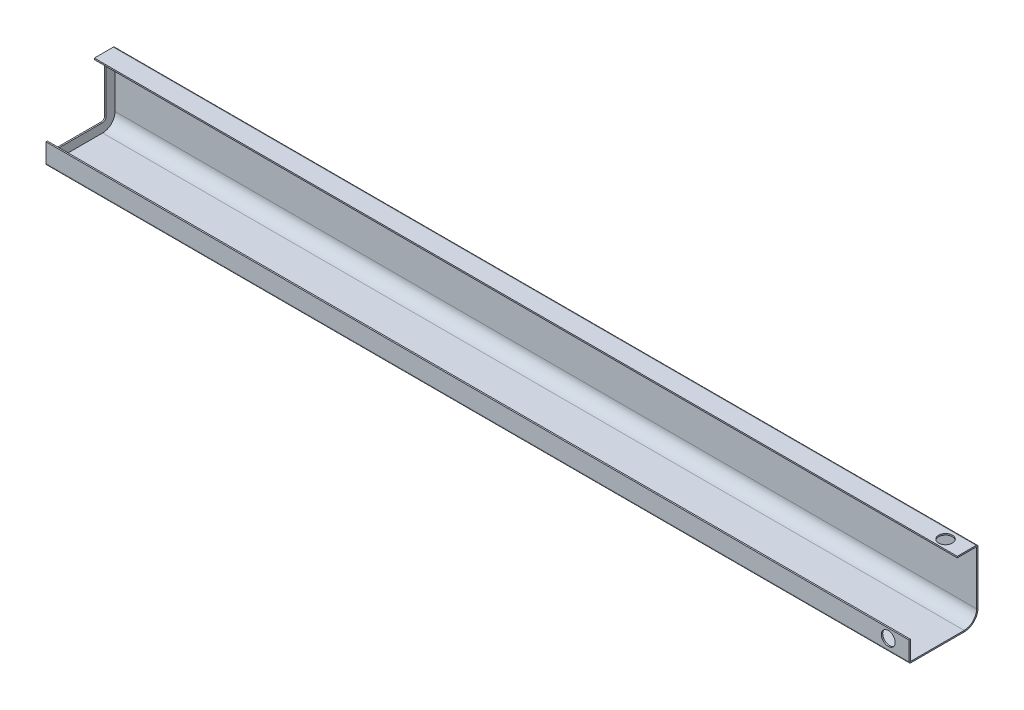
ISO-10303-21;
HEADER;
FILE_DESCRIPTION(('STEP AP214'),'2;1');
FILE_NAME('part.step','',(''),(''),'','','');
FILE_SCHEMA(('AUTOMOTIVE_DESIGN { 1 0 10303 214 1 1 1 1 }'));
ENDSEC;
DATA;
#1=APPLICATION_CONTEXT('core data for automotive mechanical design processes');
#2=APPLICATION_PROTOCOL_DEFINITION('international standard','automotive_design',2000,#1);
#3=PRODUCT_CONTEXT('',#1,'mechanical');
#4=PRODUCT('Part','Part','',(#3));
#5=PRODUCT_RELATED_PRODUCT_CATEGORY('part','',(#4));
#6=PRODUCT_DEFINITION_FORMATION('','',#4);
#7=PRODUCT_DEFINITION_CONTEXT('part definition',#1,'design');
#8=PRODUCT_DEFINITION('design','',#6,#7);
#9=PRODUCT_DEFINITION_SHAPE('','',#8);
#10=(LENGTH_UNIT() NAMED_UNIT(*) SI_UNIT(.MILLI.,.METRE.));
#11=(NAMED_UNIT(*) PLANE_ANGLE_UNIT() SI_UNIT($,.RADIAN.));
#12=(NAMED_UNIT(*) SI_UNIT($,.STERADIAN.) SOLID_ANGLE_UNIT());
#13=UNCERTAINTY_MEASURE_WITH_UNIT(LENGTH_MEASURE(1.E-05),#10,'distance_accuracy_value','');
#14=(GEOMETRIC_REPRESENTATION_CONTEXT(3) GLOBAL_UNCERTAINTY_ASSIGNED_CONTEXT((#13)) GLOBAL_UNIT_ASSIGNED_CONTEXT((#10,
#11,#12)) REPRESENTATION_CONTEXT('',''));
#15=CARTESIAN_POINT('',(0.,0.,0.));
#16=DIRECTION('',(0.,0.,1.));
#17=DIRECTION('',(1.,0.,0.));
#18=AXIS2_PLACEMENT_3D('',#15,#16,#17);
#19=CARTESIAN_POINT('',(0.,-48.,-1.73472347597681E-13));
#20=DIRECTION('',(0.,-1.,0.));
#21=DIRECTION('',(0.,0.,-1.));
#22=AXIS2_PLACEMENT_3D('',#19,#20,#21);
#23=PLANE('',#22);
#24=DIRECTION('',(0.,0.,-1.));
#25=VECTOR('',#24,1.);
#26=CARTESIAN_POINT('',(-623.,-48.,-1.73472347597681E-13));
#27=LINE('',#26,#25);
#28=CARTESIAN_POINT('',(-623.,-48.0000000000003,95.2633999999996));
#29=VERTEX_POINT('',#28);
#30=CARTESIAN_POINT('',(-623.,-48.0000000000001,17.9999999999999));
#31=VERTEX_POINT('',#30);
#32=EDGE_CURVE('E273',#29,#31,#27,.T.);
#33=ORIENTED_EDGE('',*,*,#32,.F.);
#34=DIRECTION('',(1.,0.,0.));
#35=VECTOR('',#34,1.);
#36=CARTESIAN_POINT('',(625.,-48.0000000000003,95.2633999999996));
#37=LINE('',#36,#35);
#38=CARTESIAN_POINT('',(625.,-48.0000000000003,95.2633999999996));
#39=VERTEX_POINT('',#38);
#40=EDGE_CURVE('E328',#39,#29,#37,.F.);
#41=ORIENTED_EDGE('',*,*,#40,.F.);
#42=DIRECTION('',(0.,0.,1.));
#43=VECTOR('',#42,1.);
#44=CARTESIAN_POINT('',(625.,-48.,-1.73472347597681E-13));
#45=LINE('',#44,#43);
#46=CARTESIAN_POINT('',(625.,-48.0000000000001,17.9999999999999));
#47=VERTEX_POINT('',#46);
#48=EDGE_CURVE('E387',#39,#47,#45,.F.);
#49=ORIENTED_EDGE('',*,*,#48,.T.);
#50=DIRECTION('',(-1.,0.,0.));
#51=VECTOR('',#50,1.);
#52=CARTESIAN_POINT('',(-625.,-48.0000000000001,17.9999999999999));
#53=LINE('',#52,#51);
#54=EDGE_CURVE('E379',#31,#47,#53,.F.);
#55=ORIENTED_EDGE('',*,*,#54,.F.);
#56=EDGE_LOOP('',(#33,#41,#49,#55));
#57=FACE_BOUND('',#56,.T.);
#58=ADVANCED_FACE('F97',(#57),#23,.F.);
#59=CARTESIAN_POINT('',(0.,0.,0.));
#60=DIRECTION('',(0.,0.,1.));
#61=DIRECTION('',(1.,0.,0.));
#62=AXIS2_PLACEMENT_3D('',#59,#60,#61);
#63=PLANE('',#62);
#64=DIRECTION('',(-1.,0.,0.));
#65=VECTOR('',#64,1.);
#66=CARTESIAN_POINT('',(-625.,47.2634,0.));
#67=LINE('',#66,#65);
#68=CARTESIAN_POINT('',(-623.,47.2634,0.));
#69=VERTEX_POINT('',#68);
#70=CARTESIAN_POINT('',(625.,47.2634,0.));
#71=VERTEX_POINT('',#70);
#72=EDGE_CURVE('E338',#69,#71,#67,.F.);
#73=ORIENTED_EDGE('',*,*,#72,.F.);
#74=DIRECTION('',(0.,-1.,0.));
#75=VECTOR('',#74,1.);
#76=CARTESIAN_POINT('',(-623.,0.,0.));
#77=LINE('',#76,#75);
#78=CARTESIAN_POINT('',(-623.,-30.0000000000001,0.));
#79=VERTEX_POINT('',#78);
#80=EDGE_CURVE('E120',#69,#79,#77,.T.);
#81=ORIENTED_EDGE('',*,*,#80,.T.);
#82=DIRECTION('',(1.,0.,0.));
#83=VECTOR('',#82,1.);
#84=CARTESIAN_POINT('',(625.,-30.0000000000001,0.));
#85=LINE('',#84,#83);
#86=CARTESIAN_POINT('',(625.,-30.0000000000001,0.));
#87=VERTEX_POINT('',#86);
#88=EDGE_CURVE('E405',#87,#79,#85,.F.);
#89=ORIENTED_EDGE('',*,*,#88,.F.);
#90=DIRECTION('',(0.,1.,0.));
#91=VECTOR('',#90,1.);
#92=CARTESIAN_POINT('',(625.,50.,0.));
#93=LINE('',#92,#91);
#94=EDGE_CURVE('E411',#87,#71,#93,.T.);
#95=ORIENTED_EDGE('',*,*,#94,.T.);
#96=EDGE_LOOP('',(#73,#81,#89,#95));
#97=FACE_BOUND('',#96,.T.);
#98=ADVANCED_FACE('F464',(#97),#63,.T.);
#99=CARTESIAN_POINT('',(625.,-30.0000000000001,18.));
#100=DIRECTION('',(1.,0.,0.));
#101=DIRECTION('',(0.,-1.,0.));
#102=AXIS2_PLACEMENT_3D('',#99,#100,#101);
#103=CYLINDRICAL_SURFACE('',#102,18.);
#104=CARTESIAN_POINT('',(-623.,-30.0000000000001,18.));
#105=DIRECTION('',(-1.,0.,0.));
#106=DIRECTION('',(0.,0.,1.));
#107=AXIS2_PLACEMENT_3D('',#104,#105,#106);
#108=CIRCLE('',#107,18.);
#109=EDGE_CURVE('E112',#31,#79,#108,.F.);
#110=ORIENTED_EDGE('',*,*,#109,.F.);
#111=ORIENTED_EDGE('',*,*,#54,.T.);
#112=CARTESIAN_POINT('',(625.,-30.0000000000001,18.));
#113=DIRECTION('',(1.,0.,0.));
#114=DIRECTION('',(0.,0.,-1.));
#115=AXIS2_PLACEMENT_3D('',#112,#113,#114);
#116=CIRCLE('',#115,18.);
#117=EDGE_CURVE('E383',#47,#87,#116,.T.);
#118=ORIENTED_EDGE('',*,*,#117,.T.);
#119=ORIENTED_EDGE('',*,*,#88,.T.);
#120=EDGE_LOOP('',(#110,#111,#118,#119));
#121=FACE_BOUND('',#120,.T.);
#122=ADVANCED_FACE('F459',(#121),#103,.F.);
#123=CARTESIAN_POINT('',(-625.,47.2634,0.736600000000017));
#124=DIRECTION('',(-1.,0.,0.));
#125=DIRECTION('',(0.,1.,0.));
#126=AXIS2_PLACEMENT_3D('',#123,#124,#125);
#127=CYLINDRICAL_SURFACE('',#126,0.736599999999997);
#128=CARTESIAN_POINT('',(-623.,47.2634,0.736600000000017));
#129=DIRECTION('',(-1.,0.,0.));
#130=DIRECTION('',(0.,0.,1.));
#131=AXIS2_PLACEMENT_3D('',#128,#129,#130);
#132=CIRCLE('',#131,0.736599999999997);
#133=CARTESIAN_POINT('',(-623.,48.,0.736600000000032));
#134=VERTEX_POINT('',#133);
#135=EDGE_CURVE('E278',#69,#134,#132,.F.);
#136=ORIENTED_EDGE('',*,*,#135,.F.);
#137=ORIENTED_EDGE('',*,*,#72,.T.);
#138=CARTESIAN_POINT('',(625.,47.2634,0.736600000000017));
#139=DIRECTION('',(-1.,0.,0.));
#140=DIRECTION('',(0.,0.,1.));
#141=AXIS2_PLACEMENT_3D('',#138,#139,#140);
#142=CIRCLE('',#141,0.736599999999997);
#143=CARTESIAN_POINT('',(625.,48.,0.736600000000014));
#144=VERTEX_POINT('',#143);
#145=EDGE_CURVE('E373',#71,#144,#142,.F.);
#146=ORIENTED_EDGE('',*,*,#145,.T.);
#147=DIRECTION('',(1.,0.,0.));
#148=VECTOR('',#147,1.);
#149=CARTESIAN_POINT('',(625.,48.,0.736599999999997));
#150=LINE('',#149,#148);
#151=EDGE_CURVE('E359',#144,#134,#150,.F.);
#152=ORIENTED_EDGE('',*,*,#151,.T.);
#153=EDGE_LOOP('',(#136,#137,#146,#152));
#154=FACE_BOUND('',#153,.T.);
#155=ADVANCED_FACE('F461',(#154),#127,.F.);
#156=CARTESIAN_POINT('',(625.,-47.2634000000003,95.2633999999996));
#157=DIRECTION('',(1.,0.,0.));
#158=DIRECTION('',(0.,0.,1.));
#159=AXIS2_PLACEMENT_3D('',#156,#157,#158);
#160=CYLINDRICAL_SURFACE('',#159,0.736600000000004);
#161=CARTESIAN_POINT('',(-623.,-47.2634000000003,95.2633999999996));
#162=DIRECTION('',(-1.,0.,0.));
#163=DIRECTION('',(0.,0.,1.));
#164=AXIS2_PLACEMENT_3D('',#161,#162,#163);
#165=CIRCLE('',#164,0.736600000000004);
#166=CARTESIAN_POINT('',(-623.,-47.2634000000003,95.9999999999997));
#167=VERTEX_POINT('',#166);
#168=EDGE_CURVE('E269',#167,#29,#165,.F.);
#169=ORIENTED_EDGE('',*,*,#168,.F.);
#170=DIRECTION('',(-1.,0.,0.));
#171=VECTOR('',#170,1.);
#172=CARTESIAN_POINT('',(-625.,-47.2634000000003,95.9999999999997));
#173=LINE('',#172,#171);
#174=CARTESIAN_POINT('',(625.,-47.2634000000003,95.9999999999997));
#175=VERTEX_POINT('',#174);
#176=EDGE_CURVE('E317',#167,#175,#173,.F.);
#177=ORIENTED_EDGE('',*,*,#176,.T.);
#178=CARTESIAN_POINT('',(625.,-47.2634000000003,95.2633999999996));
#179=DIRECTION('',(1.,0.,0.));
#180=DIRECTION('',(0.,0.,-1.));
#181=AXIS2_PLACEMENT_3D('',#178,#179,#180);
#182=CIRCLE('',#181,0.736600000000004);
#183=EDGE_CURVE('E292',#175,#39,#182,.T.);
#184=ORIENTED_EDGE('',*,*,#183,.T.);
#185=ORIENTED_EDGE('',*,*,#40,.T.);
#186=EDGE_LOOP('',(#169,#177,#184,#185));
#187=FACE_BOUND('',#186,.T.);
#188=ADVANCED_FACE('F447',(#187),#160,.F.);
#189=CARTESIAN_POINT('',(625.,-50.,0.));
#190=DIRECTION('',(1.,0.,0.));
#191=DIRECTION('',(0.,0.,-1.));
#192=AXIS2_PLACEMENT_3D('',#189,#190,#191);
#193=PLANE('',#192);
#194=ORIENTED_EDGE('',*,*,#48,.F.);
#195=DIRECTION('',(0.,-1.,0.));
#196=VECTOR('',#195,1.);
#197=CARTESIAN_POINT('',(625.,-48.0000000000003,95.2633999999996));
#198=LINE('',#197,#196);
#199=CARTESIAN_POINT('',(625.,-50.0000000000003,95.2633999999996));
#200=VERTEX_POINT('',#199);
#201=EDGE_CURVE('E325',#39,#200,#198,.T.);
#202=ORIENTED_EDGE('',*,*,#201,.T.);
#203=DIRECTION('',(0.,0.,-1.));
#204=VECTOR('',#203,1.);
#205=CARTESIAN_POINT('',(625.,-50.,0.));
#206=LINE('',#205,#204);
#207=CARTESIAN_POINT('',(625.,-50.0000000000001,17.9999999999999));
#208=VERTEX_POINT('',#207);
#209=EDGE_CURVE('E380',#200,#208,#206,.T.);
#210=ORIENTED_EDGE('',*,*,#209,.T.);
#211=DIRECTION('',(0.,-1.,0.));
#212=VECTOR('',#211,1.);
#213=CARTESIAN_POINT('',(625.,-48.0000000000001,17.9999999999999));
#214=LINE('',#213,#212);
#215=EDGE_CURVE('E392',#47,#208,#214,.T.);
#216=ORIENTED_EDGE('',*,*,#215,.F.);
#217=EDGE_LOOP('',(#194,#202,#210,#216));
#218=FACE_BOUND('',#217,.T.);
#219=ADVANCED_FACE('F453',(#218),#193,.T.);
#220=CARTESIAN_POINT('',(0.,-50.,-1.80455310275368E-13));
#221=DIRECTION('',(0.,-1.,0.));
#222=DIRECTION('',(0.,0.,-1.));
#223=AXIS2_PLACEMENT_3D('',#220,#221,#222);
#224=PLANE('',#223);
#225=DIRECTION('',(1.,0.,0.));
#226=VECTOR('',#225,1.);
#227=CARTESIAN_POINT('',(0.,-50.0000000000001,17.9999999999999));
#228=LINE('',#227,#226);
#229=CARTESIAN_POINT('',(-625.,-50.0000000000001,17.9999999999999));
#230=VERTEX_POINT('',#229);
#231=EDGE_CURVE('E390',#230,#208,#228,.T.);
#232=ORIENTED_EDGE('',*,*,#231,.T.);
#233=ORIENTED_EDGE('',*,*,#209,.F.);
#234=DIRECTION('',(1.,0.,0.));
#235=VECTOR('',#234,1.);
#236=CARTESIAN_POINT('',(625.,-50.0000000000003,95.2633999999996));
#237=LINE('',#236,#235);
#238=CARTESIAN_POINT('',(-625.,-50.0000000000003,95.2633999999996));
#239=VERTEX_POINT('',#238);
#240=EDGE_CURVE('E319',#200,#239,#237,.F.);
#241=ORIENTED_EDGE('',*,*,#240,.T.);
#242=DIRECTION('',(0.,0.,1.));
#243=VECTOR('',#242,1.);
#244=CARTESIAN_POINT('',(-625.,-50.0000000000003,97.9999999999996));
#245=LINE('',#244,#243);
#246=EDGE_CURVE('E384',#230,#239,#245,.T.);
#247=ORIENTED_EDGE('',*,*,#246,.F.);
#248=EDGE_LOOP('',(#232,#233,#241,#247));
#249=FACE_BOUND('',#248,.T.);
#250=ADVANCED_FACE('F507',(#249),#224,.T.);
#251=CARTESIAN_POINT('',(0.,0.,-2.));
#252=DIRECTION('',(0.,0.,1.));
#253=DIRECTION('',(1.,0.,0.));
#254=AXIS2_PLACEMENT_3D('',#251,#252,#253);
#255=PLANE('',#254);
#256=DIRECTION('',(-1.,0.,0.));
#257=VECTOR('',#256,1.);
#258=CARTESIAN_POINT('',(-625.,47.2634,-1.99999999999998));
#259=LINE('',#258,#257);
#260=CARTESIAN_POINT('',(-625.,47.2634,-1.99999999999998));
#261=VERTEX_POINT('',#260);
#262=CARTESIAN_POINT('',(625.,47.2634,-2.));
#263=VERTEX_POINT('',#262);
#264=EDGE_CURVE('E364',#261,#263,#259,.F.);
#265=ORIENTED_EDGE('',*,*,#264,.T.);
#266=DIRECTION('',(0.,1.,0.));
#267=VECTOR('',#266,1.);
#268=CARTESIAN_POINT('',(625.,50.,-2.));
#269=LINE('',#268,#267);
#270=CARTESIAN_POINT('',(625.,-30.0000000000001,-2.00000000000002));
#271=VERTEX_POINT('',#270);
#272=EDGE_CURVE('E412',#271,#263,#269,.T.);
#273=ORIENTED_EDGE('',*,*,#272,.F.);
#274=DIRECTION('',(1.,0.,0.));
#275=VECTOR('',#274,1.);
#276=CARTESIAN_POINT('',(625.,-30.0000000000001,-2.00000000000002));
#277=LINE('',#276,#275);
#278=CARTESIAN_POINT('',(-625.,-30.,-2.));
#279=VERTEX_POINT('',#278);
#280=EDGE_CURVE('E396',#271,#279,#277,.F.);
#281=ORIENTED_EDGE('',*,*,#280,.T.);
#282=DIRECTION('',(0.,-1.,0.));
#283=VECTOR('',#282,1.);
#284=CARTESIAN_POINT('',(-625.,50.,-2.));
#285=LINE('',#284,#283);
#286=EDGE_CURVE('E415',#261,#279,#285,.T.);
#287=ORIENTED_EDGE('',*,*,#286,.F.);
#288=EDGE_LOOP('',(#265,#273,#281,#287));
#289=FACE_BOUND('',#288,.T.);
#290=ADVANCED_FACE('F521',(#289),#255,.F.);
#291=CARTESIAN_POINT('',(625.,50.,-2.));
#292=DIRECTION('',(1.,0.,0.));
#293=DIRECTION('',(0.,0.,-1.));
#294=AXIS2_PLACEMENT_3D('',#291,#292,#293);
#295=PLANE('',#294);
#296=DIRECTION('',(0.,0.,-1.));
#297=VECTOR('',#296,1.);
#298=CARTESIAN_POINT('',(625.,47.2634,0.));
#299=LINE('',#298,#297);
#300=EDGE_CURVE('E370',#71,#263,#299,.T.);
#301=ORIENTED_EDGE('',*,*,#300,.F.);
#302=ORIENTED_EDGE('',*,*,#94,.F.);
#303=DIRECTION('',(0.,0.,-1.));
#304=VECTOR('',#303,1.);
#305=CARTESIAN_POINT('',(625.,-30.0000000000001,0.));
#306=LINE('',#305,#304);
#307=EDGE_CURVE('E402',#87,#271,#306,.T.);
#308=ORIENTED_EDGE('',*,*,#307,.T.);
#309=ORIENTED_EDGE('',*,*,#272,.T.);
#310=EDGE_LOOP('',(#301,#302,#308,#309));
#311=FACE_BOUND('',#310,.T.);
#312=ADVANCED_FACE('F99',(#311),#295,.T.);
#313=CARTESIAN_POINT('',(-625.,-30.0000000000001,18.));
#314=DIRECTION('',(-1.,0.,0.));
#315=DIRECTION('',(0.,0.,1.));
#316=AXIS2_PLACEMENT_3D('',#313,#314,#315);
#317=PLANE('',#316);
#318=ORIENTED_EDGE('',*,*,#286,.T.);
#319=CARTESIAN_POINT('',(-625.,-30.0000000000001,18.));
#320=DIRECTION('',(1.,0.,0.));
#321=DIRECTION('',(0.,0.,-1.));
#322=AXIS2_PLACEMENT_3D('',#319,#320,#321);
#323=CIRCLE('',#322,20.);
#324=EDGE_CURVE('E398',#279,#230,#323,.F.);
#325=ORIENTED_EDGE('',*,*,#324,.T.);
#326=ORIENTED_EDGE('',*,*,#246,.T.);
#327=CARTESIAN_POINT('',(-625.,-47.2634000000003,95.2633999999996));
#328=DIRECTION('',(1.,0.,0.));
#329=DIRECTION('',(0.,0.,-1.));
#330=AXIS2_PLACEMENT_3D('',#327,#328,#329);
#331=CIRCLE('',#330,2.7366);
#332=CARTESIAN_POINT('',(-625.,-47.2634000000004,97.9999999999997));
#333=VERTEX_POINT('',#332);
#334=EDGE_CURVE('E321',#239,#333,#331,.F.);
#335=ORIENTED_EDGE('',*,*,#334,.T.);
#336=DIRECTION('',(0.,1.,0.));
#337=VECTOR('',#336,1.);
#338=CARTESIAN_POINT('',(-625.,-20.0000000000003,97.9999999999999));
#339=LINE('',#338,#337);
#340=CARTESIAN_POINT('',(-625.,-20.0000000000003,97.9999999999999));
#341=VERTEX_POINT('',#340);
#342=EDGE_CURVE('E302',#333,#341,#339,.T.);
#343=ORIENTED_EDGE('',*,*,#342,.T.);
#344=DIRECTION('',(0.,0.,-1.));
#345=VECTOR('',#344,1.);
#346=CARTESIAN_POINT('',(-625.,-20.0000000000003,97.9999999999999));
#347=LINE('',#346,#345);
#348=CARTESIAN_POINT('',(-625.,-20.0000000000003,95.9999999999998));
#349=VERTEX_POINT('',#348);
#350=EDGE_CURVE('E293',#341,#349,#347,.T.);
#351=ORIENTED_EDGE('',*,*,#350,.T.);
#352=DIRECTION('',(0.,-1.,0.));
#353=VECTOR('',#352,1.);
#354=CARTESIAN_POINT('',(-625.,-6.73072708679001E-13,96.));
#355=LINE('',#354,#353);
#356=CARTESIAN_POINT('',(-625.,-35.0000000000001,95.9999999999998));
#357=VERTEX_POINT('',#356);
#358=EDGE_CURVE('E310',#357,#349,#355,.F.);
#359=ORIENTED_EDGE('',*,*,#358,.F.);
#360=DIRECTION('',(0.,0.,-1.));
#361=VECTOR('',#360,1.);
#362=CARTESIAN_POINT('',(-625.,-35.0000000000001,18.));
#363=LINE('',#362,#361);
#364=CARTESIAN_POINT('',(-625.,-35.,18.));
#365=VERTEX_POINT('',#364);
#366=EDGE_CURVE('E264',#357,#365,#363,.T.);
#367=ORIENTED_EDGE('',*,*,#366,.T.);
#368=CARTESIAN_POINT('',(-625.,-30.0000000000001,18.));
#369=DIRECTION('',(1.,0.,0.));
#370=DIRECTION('',(0.,0.,1.));
#371=AXIS2_PLACEMENT_3D('',#368,#369,#370);
#372=CIRCLE('',#371,4.99999999999998);
#373=CARTESIAN_POINT('',(-625.,-30.0000000000001,13.));
#374=VERTEX_POINT('',#373);
#375=EDGE_CURVE('E252',#365,#374,#372,.T.);
#376=ORIENTED_EDGE('',*,*,#375,.T.);
#377=DIRECTION('',(0.,1.,0.));
#378=VECTOR('',#377,1.);
#379=CARTESIAN_POINT('',(-625.,50.0000000000001,13.));
#380=LINE('',#379,#378);
#381=CARTESIAN_POINT('',(-625.,48.,13.));
#382=VERTEX_POINT('',#381);
#383=EDGE_CURVE('E246',#374,#382,#380,.T.);
#384=ORIENTED_EDGE('',*,*,#383,.T.);
#385=DIRECTION('',(0.,0.,1.));
#386=VECTOR('',#385,1.);
#387=CARTESIAN_POINT('',(-625.,48.,-1.73472347597681E-13));
#388=LINE('',#387,#386);
#389=CARTESIAN_POINT('',(-625.,48.0000000000001,28.));
#390=VERTEX_POINT('',#389);
#391=EDGE_CURVE('E350',#390,#382,#388,.F.);
#392=ORIENTED_EDGE('',*,*,#391,.F.);
#393=DIRECTION('',(0.,-1.,0.));
#394=VECTOR('',#393,1.);
#395=CARTESIAN_POINT('',(-625.,50.0000000000001,28.));
#396=LINE('',#395,#394);
#397=CARTESIAN_POINT('',(-625.,50.0000000000001,28.));
#398=VERTEX_POINT('',#397);
#399=EDGE_CURVE('E336',#398,#390,#396,.T.);
#400=ORIENTED_EDGE('',*,*,#399,.F.);
#401=DIRECTION('',(0.,0.,-1.));
#402=VECTOR('',#401,1.);
#403=CARTESIAN_POINT('',(-625.,50.,0.));
#404=LINE('',#403,#402);
#405=CARTESIAN_POINT('',(-625.,50.,0.736600000000025));
#406=VERTEX_POINT('',#405);
#407=EDGE_CURVE('E342',#398,#406,#404,.T.);
#408=ORIENTED_EDGE('',*,*,#407,.T.);
#409=CARTESIAN_POINT('',(-625.,47.2634,0.736600000000017));
#410=DIRECTION('',(-1.,0.,0.));
#411=DIRECTION('',(0.,0.,1.));
#412=AXIS2_PLACEMENT_3D('',#409,#410,#411);
#413=CIRCLE('',#412,2.7366);
#414=EDGE_CURVE('E367',#406,#261,#413,.T.);
#415=ORIENTED_EDGE('',*,*,#414,.T.);
#416=EDGE_LOOP('',(#318,#325,#326,#335,#343,#351,#359,#367,#376,#384,#392,#400,#408,#415));
#417=FACE_BOUND('',#416,.T.);
#418=ADVANCED_FACE('F429',(#417),#317,.T.);
#419=CARTESIAN_POINT('',(625.,-30.0000000000001,18.));
#420=DIRECTION('',(-1.,0.,0.));
#421=DIRECTION('',(0.,0.,1.));
#422=AXIS2_PLACEMENT_3D('',#419,#420,#421);
#423=PLANE('',#422);
#424=ORIENTED_EDGE('',*,*,#117,.F.);
#425=ORIENTED_EDGE('',*,*,#215,.T.);
#426=CARTESIAN_POINT('',(625.,-30.0000000000001,18.));
#427=DIRECTION('',(1.,0.,0.));
#428=DIRECTION('',(0.,0.,-1.));
#429=AXIS2_PLACEMENT_3D('',#426,#427,#428);
#430=CIRCLE('',#429,20.);
#431=EDGE_CURVE('E399',#208,#271,#430,.T.);
#432=ORIENTED_EDGE('',*,*,#431,.T.);
#433=ORIENTED_EDGE('',*,*,#307,.F.);
#434=EDGE_LOOP('',(#424,#425,#432,#433));
#435=FACE_BOUND('',#434,.T.);
#436=ADVANCED_FACE('F457',(#435),#423,.F.);
#437=CARTESIAN_POINT('',(625.,-30.0000000000001,18.));
#438=DIRECTION('',(1.,0.,0.));
#439=DIRECTION('',(0.,-1.,0.));
#440=AXIS2_PLACEMENT_3D('',#437,#438,#439);
#441=CYLINDRICAL_SURFACE('',#440,20.);
#442=ORIENTED_EDGE('',*,*,#324,.F.);
#443=ORIENTED_EDGE('',*,*,#280,.F.);
#444=ORIENTED_EDGE('',*,*,#431,.F.);
#445=ORIENTED_EDGE('',*,*,#231,.F.);
#446=EDGE_LOOP('',(#442,#443,#444,#445));
#447=FACE_BOUND('',#446,.T.);
#448=ADVANCED_FACE('F511',(#447),#441,.T.);
#449=CARTESIAN_POINT('',(625.,47.2634,0.736600000000017));
#450=DIRECTION('',(1.,0.,0.));
#451=DIRECTION('',(0.,0.,-1.));
#452=AXIS2_PLACEMENT_3D('',#449,#450,#451);
#453=PLANE('',#452);
#454=DIRECTION('',(0.,1.,0.));
#455=VECTOR('',#454,1.);
#456=CARTESIAN_POINT('',(625.,50.,0.73659999999999));
#457=LINE('',#456,#455);
#458=CARTESIAN_POINT('',(625.,50.,0.736600000000007));
#459=VERTEX_POINT('',#458);
#460=EDGE_CURVE('E335',#144,#459,#457,.T.);
#461=ORIENTED_EDGE('',*,*,#460,.F.);
#462=ORIENTED_EDGE('',*,*,#145,.F.);
#463=ORIENTED_EDGE('',*,*,#300,.T.);
#464=CARTESIAN_POINT('',(625.,47.2634,0.736600000000017));
#465=DIRECTION('',(-1.,0.,0.));
#466=DIRECTION('',(0.,0.,1.));
#467=AXIS2_PLACEMENT_3D('',#464,#465,#466);
#468=CIRCLE('',#467,2.7366);
#469=EDGE_CURVE('E366',#263,#459,#468,.F.);
#470=ORIENTED_EDGE('',*,*,#469,.T.);
#471=EDGE_LOOP('',(#461,#462,#463,#470));
#472=FACE_BOUND('',#471,.T.);
#473=ADVANCED_FACE('F469',(#472),#453,.T.);
#474=CARTESIAN_POINT('',(-625.,47.2634,0.736600000000017));
#475=DIRECTION('',(-1.,0.,0.));
#476=DIRECTION('',(0.,1.,0.));
#477=AXIS2_PLACEMENT_3D('',#474,#475,#476);
#478=CYLINDRICAL_SURFACE('',#477,2.7366);
#479=ORIENTED_EDGE('',*,*,#414,.F.);
#480=DIRECTION('',(-1.,0.,0.));
#481=VECTOR('',#480,1.);
#482=CARTESIAN_POINT('',(0.,50.,0.736600000000007));
#483=LINE('',#482,#481);
#484=EDGE_CURVE('E357',#459,#406,#483,.T.);
#485=ORIENTED_EDGE('',*,*,#484,.F.);
#486=ORIENTED_EDGE('',*,*,#469,.F.);
#487=ORIENTED_EDGE('',*,*,#264,.F.);
#488=EDGE_LOOP('',(#479,#485,#486,#487));
#489=FACE_BOUND('',#488,.T.);
#490=ADVANCED_FACE('F536',(#489),#478,.T.);
#491=CARTESIAN_POINT('',(625.,50.0000000000001,28.));
#492=DIRECTION('',(1.,0.,0.));
#493=DIRECTION('',(0.,0.,-1.));
#494=AXIS2_PLACEMENT_3D('',#491,#492,#493);
#495=PLANE('',#494);
#496=DIRECTION('',(0.,0.,-1.));
#497=VECTOR('',#496,1.);
#498=CARTESIAN_POINT('',(625.,48.,-1.73472347597681E-13));
#499=LINE('',#498,#497);
#500=CARTESIAN_POINT('',(625.,48.0000000000001,28.));
#501=VERTEX_POINT('',#500);
#502=EDGE_CURVE('E355',#144,#501,#499,.F.);
#503=ORIENTED_EDGE('',*,*,#502,.F.);
#504=ORIENTED_EDGE('',*,*,#460,.T.);
#505=DIRECTION('',(0.,0.,1.));
#506=VECTOR('',#505,1.);
#507=CARTESIAN_POINT('',(625.,50.0000000000001,28.));
#508=LINE('',#507,#506);
#509=CARTESIAN_POINT('',(625.,50.0000000000001,28.));
#510=VERTEX_POINT('',#509);
#511=EDGE_CURVE('E348',#459,#510,#508,.T.);
#512=ORIENTED_EDGE('',*,*,#511,.T.);
#513=DIRECTION('',(0.,-1.,0.));
#514=VECTOR('',#513,1.);
#515=CARTESIAN_POINT('',(625.,50.0000000000001,28.));
#516=LINE('',#515,#514);
#517=EDGE_CURVE('E339',#510,#501,#516,.T.);
#518=ORIENTED_EDGE('',*,*,#517,.T.);
#519=EDGE_LOOP('',(#503,#504,#512,#518));
#520=FACE_BOUND('',#519,.T.);
#521=ADVANCED_FACE('F475',(#520),#495,.T.);
#522=CARTESIAN_POINT('',(0.,50.,-1.80455310275367E-13));
#523=DIRECTION('',(0.,1.,0.));
#524=DIRECTION('',(0.,0.,1.));
#525=AXIS2_PLACEMENT_3D('',#522,#523,#524);
#526=PLANE('',#525);
#527=ORIENTED_EDGE('',*,*,#484,.T.);
#528=ORIENTED_EDGE('',*,*,#407,.F.);
#529=DIRECTION('',(-1.,0.,0.));
#530=VECTOR('',#529,1.);
#531=CARTESIAN_POINT('',(-625.,50.0000000000001,28.));
#532=LINE('',#531,#530);
#533=EDGE_CURVE('E345',#510,#398,#532,.T.);
#534=ORIENTED_EDGE('',*,*,#533,.F.);
#535=ORIENTED_EDGE('',*,*,#511,.F.);
#536=EDGE_LOOP('',(#527,#528,#534,#535));
#537=FACE_BOUND('',#536,.T.);
#538=CARTESIAN_POINT('',(595.,50.0000000000001,15.));
#539=DIRECTION('',(0.,1.,0.));
#540=DIRECTION('',(0.,0.,1.));
#541=AXIS2_PLACEMENT_3D('',#538,#539,#540);
#542=CIRCLE('',#541,9.99999999999998);
#543=CARTESIAN_POINT('',(595.,50.0000000000001,25.));
#544=VERTEX_POINT('',#543);
#545=EDGE_CURVE('E286',#544,#544,#542,.T.);
#546=ORIENTED_EDGE('',*,*,#545,.F.);
#547=EDGE_LOOP('',(#546));
#548=FACE_BOUND('',#547,.T.);
#549=ADVANCED_FACE('F538',(#537,#548),#526,.T.);
#550=CARTESIAN_POINT('',(0.,48.,-1.73472347597681E-13));
#551=DIRECTION('',(0.,1.,0.));
#552=DIRECTION('',(0.,0.,1.));
#553=AXIS2_PLACEMENT_3D('',#550,#551,#552);
#554=PLANE('',#553);
#555=CARTESIAN_POINT('',(595.,48.0000000000001,15.));
#556=DIRECTION('',(0.,1.,0.));
#557=DIRECTION('',(0.,0.,1.));
#558=AXIS2_PLACEMENT_3D('',#555,#556,#557);
#559=CIRCLE('',#558,9.99999999999998);
#560=CARTESIAN_POINT('',(595.,48.0000000000001,25.));
#561=VERTEX_POINT('',#560);
#562=EDGE_CURVE('E289',#561,#561,#559,.T.);
#563=ORIENTED_EDGE('',*,*,#562,.T.);
#564=EDGE_LOOP('',(#563));
#565=FACE_BOUND('',#564,.T.);
#566=ORIENTED_EDGE('',*,*,#391,.T.);
#567=DIRECTION('',(1.,0.,0.));
#568=VECTOR('',#567,1.);
#569=CARTESIAN_POINT('',(0.,48.,13.));
#570=LINE('',#569,#568);
#571=CARTESIAN_POINT('',(-623.,48.,13.));
#572=VERTEX_POINT('',#571);
#573=EDGE_CURVE('E13',#382,#572,#570,.T.);
#574=ORIENTED_EDGE('',*,*,#573,.T.);
#575=DIRECTION('',(0.,0.,1.));
#576=VECTOR('',#575,1.);
#577=CARTESIAN_POINT('',(-623.,48.,-1.73472347597681E-13));
#578=LINE('',#577,#576);
#579=EDGE_CURVE('E280',#134,#572,#578,.T.);
#580=ORIENTED_EDGE('',*,*,#579,.F.);
#581=ORIENTED_EDGE('',*,*,#151,.F.);
#582=ORIENTED_EDGE('',*,*,#502,.T.);
#583=DIRECTION('',(1.,0.,0.));
#584=VECTOR('',#583,1.);
#585=CARTESIAN_POINT('',(0.,48.0000000000001,28.));
#586=LINE('',#585,#584);
#587=EDGE_CURVE('E352',#501,#390,#586,.F.);
#588=ORIENTED_EDGE('',*,*,#587,.T.);
#589=EDGE_LOOP('',(#566,#574,#580,#581,#582,#588));
#590=FACE_BOUND('',#589,.T.);
#591=ADVANCED_FACE('F473',(#565,#590),#554,.F.);
#592=CARTESIAN_POINT('',(-625.,50.0000000000001,28.));
#593=DIRECTION('',(0.,0.,1.));
#594=DIRECTION('',(0.,-1.,0.));
#595=AXIS2_PLACEMENT_3D('',#592,#593,#594);
#596=PLANE('',#595);
#597=ORIENTED_EDGE('',*,*,#587,.F.);
#598=ORIENTED_EDGE('',*,*,#517,.F.);
#599=ORIENTED_EDGE('',*,*,#533,.T.);
#600=ORIENTED_EDGE('',*,*,#399,.T.);
#601=EDGE_LOOP('',(#597,#598,#599,#600));
#602=FACE_BOUND('',#601,.T.);
#603=ADVANCED_FACE('F481',(#602),#596,.T.);
#604=CARTESIAN_POINT('',(625.,-47.2634000000003,95.2633999999996));
#605=DIRECTION('',(-1.,0.,0.));
#606=DIRECTION('',(0.,0.,1.));
#607=AXIS2_PLACEMENT_3D('',#604,#605,#606);
#608=PLANE('',#607);
#609=ORIENTED_EDGE('',*,*,#183,.F.);
#610=DIRECTION('',(0.,0.,1.));
#611=VECTOR('',#610,1.);
#612=CARTESIAN_POINT('',(625.,-47.2634000000003,95.9999999999997));
#613=LINE('',#612,#611);
#614=CARTESIAN_POINT('',(625.,-47.2634000000003,97.9999999999997));
#615=VERTEX_POINT('',#614);
#616=EDGE_CURVE('E314',#175,#615,#613,.T.);
#617=ORIENTED_EDGE('',*,*,#616,.T.);
#618=CARTESIAN_POINT('',(625.,-47.2634000000003,95.2633999999996));
#619=DIRECTION('',(1.,0.,0.));
#620=DIRECTION('',(0.,0.,-1.));
#621=AXIS2_PLACEMENT_3D('',#618,#619,#620);
#622=CIRCLE('',#621,2.7366);
#623=EDGE_CURVE('E322',#615,#200,#622,.T.);
#624=ORIENTED_EDGE('',*,*,#623,.T.);
#625=ORIENTED_EDGE('',*,*,#201,.F.);
#626=EDGE_LOOP('',(#609,#617,#624,#625));
#627=FACE_BOUND('',#626,.T.);
#628=ADVANCED_FACE('F443',(#627),#608,.F.);
#629=CARTESIAN_POINT('',(625.,-47.2634000000003,95.2633999999996));
#630=DIRECTION('',(1.,0.,0.));
#631=DIRECTION('',(0.,0.,1.));
#632=AXIS2_PLACEMENT_3D('',#629,#630,#631);
#633=CYLINDRICAL_SURFACE('',#632,2.7366);
#634=ORIENTED_EDGE('',*,*,#334,.F.);
#635=ORIENTED_EDGE('',*,*,#240,.F.);
#636=ORIENTED_EDGE('',*,*,#623,.F.);
#637=DIRECTION('',(1.,0.,0.));
#638=VECTOR('',#637,1.);
#639=CARTESIAN_POINT('',(0.,-47.2634000000003,97.9999999999997));
#640=LINE('',#639,#638);
#641=EDGE_CURVE('E312',#333,#615,#640,.T.);
#642=ORIENTED_EDGE('',*,*,#641,.F.);
#643=EDGE_LOOP('',(#634,#635,#636,#642));
#644=FACE_BOUND('',#643,.T.);
#645=ADVANCED_FACE('F593',(#644),#633,.T.);
#646=CARTESIAN_POINT('',(625.,-48.0000000000003,97.9999999999997));
#647=DIRECTION('',(1.,0.,0.));
#648=DIRECTION('',(0.,0.,-1.));
#649=AXIS2_PLACEMENT_3D('',#646,#647,#648);
#650=PLANE('',#649);
#651=DIRECTION('',(0.,-1.,0.));
#652=VECTOR('',#651,1.);
#653=CARTESIAN_POINT('',(625.,-48.0000000000003,97.9999999999997));
#654=LINE('',#653,#652);
#655=CARTESIAN_POINT('',(625.,-20.0000000000003,97.9999999999999));
#656=VERTEX_POINT('',#655);
#657=EDGE_CURVE('E296',#656,#615,#654,.T.);
#658=ORIENTED_EDGE('',*,*,#657,.T.);
#659=ORIENTED_EDGE('',*,*,#616,.F.);
#660=DIRECTION('',(0.,1.,0.));
#661=VECTOR('',#660,1.);
#662=CARTESIAN_POINT('',(625.,-6.73072708679001E-13,96.));
#663=LINE('',#662,#661);
#664=CARTESIAN_POINT('',(625.,-20.0000000000003,95.9999999999998));
#665=VERTEX_POINT('',#664);
#666=EDGE_CURVE('E304',#665,#175,#663,.F.);
#667=ORIENTED_EDGE('',*,*,#666,.F.);
#668=DIRECTION('',(0.,0.,-1.));
#669=VECTOR('',#668,1.);
#670=CARTESIAN_POINT('',(625.,-20.0000000000003,97.9999999999999));
#671=LINE('',#670,#669);
#672=EDGE_CURVE('E290',#656,#665,#671,.T.);
#673=ORIENTED_EDGE('',*,*,#672,.F.);
#674=EDGE_LOOP('',(#658,#659,#667,#673));
#675=FACE_BOUND('',#674,.T.);
#676=ADVANCED_FACE('F439',(#675),#650,.T.);
#677=CARTESIAN_POINT('',(0.,-6.86994565260595E-13,98.));
#678=DIRECTION('',(0.,0.,1.));
#679=DIRECTION('',(0.,-1.,0.));
#680=AXIS2_PLACEMENT_3D('',#677,#678,#679);
#681=PLANE('',#680);
#682=DIRECTION('',(1.,0.,0.));
#683=VECTOR('',#682,1.);
#684=CARTESIAN_POINT('',(625.,-20.0000000000003,97.9999999999999));
#685=LINE('',#684,#683);
#686=EDGE_CURVE('E299',#341,#656,#685,.T.);
#687=ORIENTED_EDGE('',*,*,#686,.F.);
#688=ORIENTED_EDGE('',*,*,#342,.F.);
#689=ORIENTED_EDGE('',*,*,#641,.T.);
#690=ORIENTED_EDGE('',*,*,#657,.F.);
#691=EDGE_LOOP('',(#687,#688,#689,#690));
#692=FACE_BOUND('',#691,.T.);
#693=CARTESIAN_POINT('',(595.,-33.0000000000003,98.));
#694=DIRECTION('',(0.,0.,1.));
#695=DIRECTION('',(1.,0.,0.));
#696=AXIS2_PLACEMENT_3D('',#693,#694,#695);
#697=CIRCLE('',#696,9.99999999999998);
#698=CARTESIAN_POINT('',(605.,-33.0000000000003,98.));
#699=VERTEX_POINT('',#698);
#700=EDGE_CURVE('E282',#699,#699,#697,.T.);
#701=ORIENTED_EDGE('',*,*,#700,.F.);
#702=EDGE_LOOP('',(#701));
#703=FACE_BOUND('',#702,.T.);
#704=ADVANCED_FACE('F608',(#692,#703),#681,.T.);
#705=CARTESIAN_POINT('',(0.,-6.73072708679001E-13,96.));
#706=DIRECTION('',(0.,0.,1.));
#707=DIRECTION('',(0.,-1.,0.));
#708=AXIS2_PLACEMENT_3D('',#705,#706,#707);
#709=PLANE('',#708);
#710=CARTESIAN_POINT('',(595.,-33.0000000000003,95.9999999999998));
#711=DIRECTION('',(0.,0.,1.));
#712=DIRECTION('',(0.,-1.,0.));
#713=AXIS2_PLACEMENT_3D('',#710,#711,#712);
#714=CIRCLE('',#713,9.99999999999998);
#715=CARTESIAN_POINT('',(595.,-43.0000000000003,95.9999999999997));
#716=VERTEX_POINT('',#715);
#717=EDGE_CURVE('E285',#716,#716,#714,.T.);
#718=ORIENTED_EDGE('',*,*,#717,.T.);
#719=EDGE_LOOP('',(#718));
#720=FACE_BOUND('',#719,.T.);
#721=DIRECTION('',(0.,-1.,0.));
#722=VECTOR('',#721,1.);
#723=CARTESIAN_POINT('',(-623.,-6.73072708679001E-13,96.));
#724=LINE('',#723,#722);
#725=CARTESIAN_POINT('',(-623.,-35.,95.9999999999998));
#726=VERTEX_POINT('',#725);
#727=EDGE_CURVE('E418',#726,#167,#724,.T.);
#728=ORIENTED_EDGE('',*,*,#727,.F.);
#729=DIRECTION('',(-1.,0.,0.));
#730=VECTOR('',#729,1.);
#731=CARTESIAN_POINT('',(0.,-35.0000000000001,95.9999999999998));
#732=LINE('',#731,#730);
#733=EDGE_CURVE('E105',#726,#357,#732,.T.);
#734=ORIENTED_EDGE('',*,*,#733,.T.);
#735=ORIENTED_EDGE('',*,*,#358,.T.);
#736=DIRECTION('',(-1.,0.,0.));
#737=VECTOR('',#736,1.);
#738=CARTESIAN_POINT('',(0.,-20.0000000000003,95.9999999999998));
#739=LINE('',#738,#737);
#740=EDGE_CURVE('E307',#349,#665,#739,.F.);
#741=ORIENTED_EDGE('',*,*,#740,.T.);
#742=ORIENTED_EDGE('',*,*,#666,.T.);
#743=ORIENTED_EDGE('',*,*,#176,.F.);
#744=EDGE_LOOP('',(#728,#734,#735,#741,#742,#743));
#745=FACE_BOUND('',#744,.T.);
#746=ADVANCED_FACE('F426',(#720,#745),#709,.F.);
#747=CARTESIAN_POINT('',(625.,-20.0000000000003,97.9999999999999));
#748=DIRECTION('',(0.,1.,0.));
#749=DIRECTION('',(0.,0.,1.));
#750=AXIS2_PLACEMENT_3D('',#747,#748,#749);
#751=PLANE('',#750);
#752=ORIENTED_EDGE('',*,*,#740,.F.);
#753=ORIENTED_EDGE('',*,*,#350,.F.);
#754=ORIENTED_EDGE('',*,*,#686,.T.);
#755=ORIENTED_EDGE('',*,*,#672,.T.);
#756=EDGE_LOOP('',(#752,#753,#754,#755));
#757=FACE_BOUND('',#756,.T.);
#758=ADVANCED_FACE('F435',(#757),#751,.T.);
#759=CARTESIAN_POINT('',(595.,40.0000000000001,15.));
#760=DIRECTION('',(0.,1.,0.));
#761=DIRECTION('',(0.,0.,1.));
#762=AXIS2_PLACEMENT_3D('',#759,#760,#761);
#763=CYLINDRICAL_SURFACE('',#762,9.99999999999998);
#764=ORIENTED_EDGE('',*,*,#545,.T.);
#765=EDGE_LOOP('',(#764));
#766=FACE_BOUND('',#765,.T.);
#767=ORIENTED_EDGE('',*,*,#562,.F.);
#768=EDGE_LOOP('',(#767));
#769=FACE_BOUND('',#768,.T.);
#770=ADVANCED_FACE('F495',(#766,#769),#763,.F.);
#771=CARTESIAN_POINT('',(595.,-33.0000000000003,88.));
#772=DIRECTION('',(0.,0.,1.));
#773=DIRECTION('',(1.,0.,0.));
#774=AXIS2_PLACEMENT_3D('',#771,#772,#773);
#775=CYLINDRICAL_SURFACE('',#774,9.99999999999998);
#776=ORIENTED_EDGE('',*,*,#700,.T.);
#777=EDGE_LOOP('',(#776));
#778=FACE_BOUND('',#777,.T.);
#779=ORIENTED_EDGE('',*,*,#717,.F.);
#780=EDGE_LOOP('',(#779));
#781=FACE_BOUND('',#780,.T.);
#782=ADVANCED_FACE('F488',(#778,#781),#775,.F.);
#783=CARTESIAN_POINT('',(-623.,50.0000000000001,13.));
#784=DIRECTION('',(0.,0.,1.));
#785=DIRECTION('',(0.,-1.,0.));
#786=AXIS2_PLACEMENT_3D('',#783,#784,#785);
#787=PLANE('',#786);
#788=ORIENTED_EDGE('',*,*,#573,.F.);
#789=ORIENTED_EDGE('',*,*,#383,.F.);
#790=DIRECTION('',(-1.,0.,0.));
#791=VECTOR('',#790,1.);
#792=CARTESIAN_POINT('',(-623.,-30.0000000000001,13.));
#793=LINE('',#792,#791);
#794=CARTESIAN_POINT('',(-623.,-30.0000000000001,13.));
#795=VERTEX_POINT('',#794);
#796=EDGE_CURVE('E253',#795,#374,#793,.T.);
#797=ORIENTED_EDGE('',*,*,#796,.F.);
#798=DIRECTION('',(0.,1.,0.));
#799=VECTOR('',#798,1.);
#800=CARTESIAN_POINT('',(-623.,50.0000000000001,13.));
#801=LINE('',#800,#799);
#802=EDGE_CURVE('E254',#795,#572,#801,.T.);
#803=ORIENTED_EDGE('',*,*,#802,.T.);
#804=EDGE_LOOP('',(#788,#789,#797,#803));
#805=FACE_BOUND('',#804,.T.);
#806=ADVANCED_FACE('F486',(#805),#787,.T.);
#807=CARTESIAN_POINT('',(-623.,-35.0000000000001,18.));
#808=DIRECTION('',(0.,1.,0.));
#809=DIRECTION('',(0.,0.,1.));
#810=AXIS2_PLACEMENT_3D('',#807,#808,#809);
#811=PLANE('',#810);
#812=ORIENTED_EDGE('',*,*,#733,.F.);
#813=DIRECTION('',(0.,0.,-1.));
#814=VECTOR('',#813,1.);
#815=CARTESIAN_POINT('',(-623.,-35.0000000000001,18.));
#816=LINE('',#815,#814);
#817=CARTESIAN_POINT('',(-623.,-35.,18.));
#818=VERTEX_POINT('',#817);
#819=EDGE_CURVE('E235',#726,#818,#816,.T.);
#820=ORIENTED_EDGE('',*,*,#819,.T.);
#821=DIRECTION('',(-1.,0.,0.));
#822=VECTOR('',#821,1.);
#823=CARTESIAN_POINT('',(-623.,-35.,18.));
#824=LINE('',#823,#822);
#825=EDGE_CURVE('E239',#818,#365,#824,.T.);
#826=ORIENTED_EDGE('',*,*,#825,.T.);
#827=ORIENTED_EDGE('',*,*,#366,.F.);
#828=EDGE_LOOP('',(#812,#820,#826,#827));
#829=FACE_BOUND('',#828,.T.);
#830=ADVANCED_FACE('F237',(#829),#811,.T.);
#831=CARTESIAN_POINT('',(-623.,47.2634,0.736600000000017));
#832=DIRECTION('',(-1.,0.,0.));
#833=DIRECTION('',(0.,0.,1.));
#834=AXIS2_PLACEMENT_3D('',#831,#832,#833);
#835=PLANE('',#834);
#836=ORIENTED_EDGE('',*,*,#135,.T.);
#837=ORIENTED_EDGE('',*,*,#579,.T.);
#838=ORIENTED_EDGE('',*,*,#802,.F.);
#839=CARTESIAN_POINT('',(-623.,-30.0000000000001,18.));
#840=DIRECTION('',(1.,0.,0.));
#841=DIRECTION('',(0.,0.,1.));
#842=AXIS2_PLACEMENT_3D('',#839,#840,#841);
#843=CIRCLE('',#842,4.99999999999998);
#844=EDGE_CURVE('E245',#818,#795,#843,.T.);
#845=ORIENTED_EDGE('',*,*,#844,.F.);
#846=ORIENTED_EDGE('',*,*,#819,.F.);
#847=ORIENTED_EDGE('',*,*,#727,.T.);
#848=ORIENTED_EDGE('',*,*,#168,.T.);
#849=ORIENTED_EDGE('',*,*,#32,.T.);
#850=ORIENTED_EDGE('',*,*,#109,.T.);
#851=ORIENTED_EDGE('',*,*,#80,.F.);
#852=EDGE_LOOP('',(#836,#837,#838,#845,#846,#847,#848,#849,#850,#851));
#853=FACE_BOUND('',#852,.T.);
#854=ADVANCED_FACE('F258',(#853),#835,.F.);
#855=CARTESIAN_POINT('',(-623.,-30.0000000000001,18.));
#856=DIRECTION('',(-1.,0.,0.));
#857=DIRECTION('',(0.,0.,1.));
#858=AXIS2_PLACEMENT_3D('',#855,#856,#857);
#859=CYLINDRICAL_SURFACE('',#858,4.99999999999998);
#860=ORIENTED_EDGE('',*,*,#375,.F.);
#861=ORIENTED_EDGE('',*,*,#825,.F.);
#862=ORIENTED_EDGE('',*,*,#844,.T.);
#863=ORIENTED_EDGE('',*,*,#796,.T.);
#864=EDGE_LOOP('',(#860,#861,#862,#863));
#865=FACE_BOUND('',#864,.T.);
#866=ADVANCED_FACE('F250',(#865),#859,.F.);
#867=CLOSED_SHELL('',(#58,#98,#122,#155,#188,#219,#250,#290,#312,#418,#436,#448,#473,#490,#521,
#549,#591,#603,#628,#645,#676,#704,#746,#758,#770,#782,#806,#830,#854,#866));
#868=MANIFOLD_SOLID_BREP('B2',#867);
#869=ADVANCED_BREP_SHAPE_REPRESENTATION('',(#18,#868),#14);
#870=SHAPE_DEFINITION_REPRESENTATION(#9,#869);
ENDSEC;
END-ISO-10303-21;
